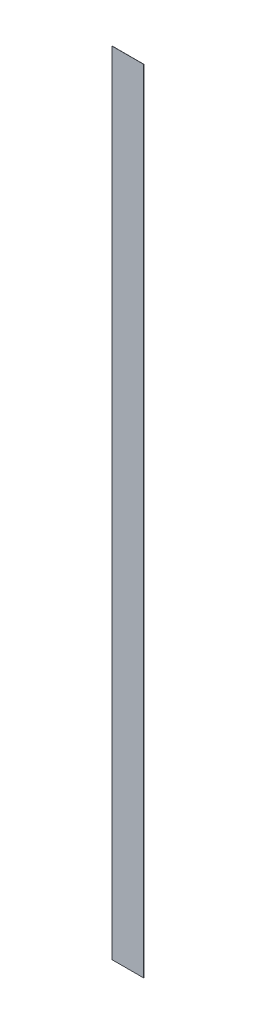
ISO-10303-21;
HEADER;
FILE_DESCRIPTION(('STEP AP214'),'2;1');
FILE_NAME('part.step','',(''),(''),'','','');
FILE_SCHEMA(('AUTOMOTIVE_DESIGN { 1 0 10303 214 1 1 1 1 }'));
ENDSEC;
DATA;
#1=APPLICATION_CONTEXT('core data for automotive mechanical design processes');
#2=APPLICATION_PROTOCOL_DEFINITION('international standard','automotive_design',2000,#1);
#3=PRODUCT_CONTEXT('',#1,'mechanical');
#4=PRODUCT('Part','Part','',(#3));
#5=PRODUCT_RELATED_PRODUCT_CATEGORY('part','',(#4));
#6=PRODUCT_DEFINITION_FORMATION('','',#4);
#7=PRODUCT_DEFINITION_CONTEXT('part definition',#1,'design');
#8=PRODUCT_DEFINITION('design','',#6,#7);
#9=PRODUCT_DEFINITION_SHAPE('','',#8);
#10=(LENGTH_UNIT() NAMED_UNIT(*) SI_UNIT(.MILLI.,.METRE.));
#11=(NAMED_UNIT(*) PLANE_ANGLE_UNIT() SI_UNIT($,.RADIAN.));
#12=(NAMED_UNIT(*) SI_UNIT($,.STERADIAN.) SOLID_ANGLE_UNIT());
#13=UNCERTAINTY_MEASURE_WITH_UNIT(LENGTH_MEASURE(1.E-05),#10,'distance_accuracy_value','');
#14=(GEOMETRIC_REPRESENTATION_CONTEXT(3) GLOBAL_UNCERTAINTY_ASSIGNED_CONTEXT((#13)) GLOBAL_UNIT_ASSIGNED_CONTEXT((#10,
#11,#12)) REPRESENTATION_CONTEXT('',''));
#15=CARTESIAN_POINT('',(0.,0.,0.));
#16=DIRECTION('',(0.,0.,1.));
#17=DIRECTION('',(1.,0.,0.));
#18=AXIS2_PLACEMENT_3D('',#15,#16,#17);
#19=CARTESIAN_POINT('',(0.,0.,15.));
#20=DIRECTION('',(-1.,0.,0.));
#21=DIRECTION('',(0.,0.,1.));
#22=AXIS2_PLACEMENT_3D('',#19,#20,#21);
#23=PLANE('',#22);
#24=DIRECTION('',(0.,1.,0.));
#25=VECTOR('',#24,1.);
#26=CARTESIAN_POINT('',(0.,0.,0.));
#27=LINE('',#26,#25);
#28=CARTESIAN_POINT('',(0.,0.,0.));
#29=VERTEX_POINT('',#28);
#30=CARTESIAN_POINT('',(0.,75000.,0.));
#31=VERTEX_POINT('',#30);
#32=EDGE_CURVE('E96',#29,#31,#27,.T.);
#33=ORIENTED_EDGE('',*,*,#32,.T.);
#34=DIRECTION('',(0.,0.,-1.));
#35=VECTOR('',#34,1.);
#36=CARTESIAN_POINT('',(0.,75000.,15.));
#37=LINE('',#36,#35);
#38=CARTESIAN_POINT('',(0.,75000.,15.));
#39=VERTEX_POINT('',#38);
#40=EDGE_CURVE('E11',#39,#31,#37,.T.);
#41=ORIENTED_EDGE('',*,*,#40,.F.);
#42=DIRECTION('',(0.,1.,0.));
#43=VECTOR('',#42,1.);
#44=CARTESIAN_POINT('',(0.,0.,15.));
#45=LINE('',#44,#43);
#46=CARTESIAN_POINT('',(0.,0.,15.));
#47=VERTEX_POINT('',#46);
#48=EDGE_CURVE('E84',#47,#39,#45,.T.);
#49=ORIENTED_EDGE('',*,*,#48,.F.);
#50=DIRECTION('',(0.,0.,-1.));
#51=VECTOR('',#50,1.);
#52=CARTESIAN_POINT('',(0.,0.,15.));
#53=LINE('',#52,#51);
#54=EDGE_CURVE('E92',#47,#29,#53,.T.);
#55=ORIENTED_EDGE('',*,*,#54,.T.);
#56=EDGE_LOOP('',(#33,#41,#49,#55));
#57=FACE_BOUND('',#56,.T.);
#58=ADVANCED_FACE('F33',(#57),#23,.F.);
#59=CARTESIAN_POINT('',(0.,75000.,15.));
#60=DIRECTION('',(0.,-1.,0.));
#61=DIRECTION('',(0.,0.,-1.));
#62=AXIS2_PLACEMENT_3D('',#59,#60,#61);
#63=PLANE('',#62);
#64=DIRECTION('',(-1.,0.,0.));
#65=VECTOR('',#64,1.);
#66=CARTESIAN_POINT('',(0.,75000.,0.));
#67=LINE('',#66,#65);
#68=CARTESIAN_POINT('',(-3000.,75000.,0.));
#69=VERTEX_POINT('',#68);
#70=EDGE_CURVE('E88',#31,#69,#67,.T.);
#71=ORIENTED_EDGE('',*,*,#70,.T.);
#72=DIRECTION('',(0.,0.,-1.));
#73=VECTOR('',#72,1.);
#74=CARTESIAN_POINT('',(-3000.,75000.,15.));
#75=LINE('',#74,#73);
#76=CARTESIAN_POINT('',(-3000.,75000.,15.));
#77=VERTEX_POINT('',#76);
#78=EDGE_CURVE('E41',#77,#69,#75,.T.);
#79=ORIENTED_EDGE('',*,*,#78,.F.);
#80=DIRECTION('',(-1.,0.,0.));
#81=VECTOR('',#80,1.);
#82=CARTESIAN_POINT('',(0.,75000.,15.));
#83=LINE('',#82,#81);
#84=EDGE_CURVE('E79',#39,#77,#83,.T.);
#85=ORIENTED_EDGE('',*,*,#84,.F.);
#86=ORIENTED_EDGE('',*,*,#40,.T.);
#87=EDGE_LOOP('',(#71,#79,#85,#86));
#88=FACE_BOUND('',#87,.T.);
#89=ADVANCED_FACE('F87',(#88),#63,.F.);
#90=CARTESIAN_POINT('',(-3000.,-3.67394039744206E-13,15.));
#91=DIRECTION('',(1.,0.,0.));
#92=DIRECTION('',(0.,0.,-1.));
#93=AXIS2_PLACEMENT_3D('',#90,#91,#92);
#94=PLANE('',#93);
#95=DIRECTION('',(0.,-1.,0.));
#96=VECTOR('',#95,1.);
#97=CARTESIAN_POINT('',(-3000.,-3.67394039744206E-13,0.));
#98=LINE('',#97,#96);
#99=CARTESIAN_POINT('',(-3000.,-3.67394039744206E-13,0.));
#100=VERTEX_POINT('',#99);
#101=EDGE_CURVE('E66',#69,#100,#98,.T.);
#102=ORIENTED_EDGE('',*,*,#101,.T.);
#103=DIRECTION('',(0.,0.,-1.));
#104=VECTOR('',#103,1.);
#105=CARTESIAN_POINT('',(-3000.,-3.67394039744206E-13,15.));
#106=LINE('',#105,#104);
#107=CARTESIAN_POINT('',(-3000.,-3.67394039744206E-13,15.));
#108=VERTEX_POINT('',#107);
#109=EDGE_CURVE('E89',#108,#100,#106,.T.);
#110=ORIENTED_EDGE('',*,*,#109,.F.);
#111=DIRECTION('',(0.,-1.,0.));
#112=VECTOR('',#111,1.);
#113=CARTESIAN_POINT('',(-3000.,-3.67394039744206E-13,15.));
#114=LINE('',#113,#112);
#115=EDGE_CURVE('E82',#77,#108,#114,.T.);
#116=ORIENTED_EDGE('',*,*,#115,.F.);
#117=ORIENTED_EDGE('',*,*,#78,.T.);
#118=EDGE_LOOP('',(#102,#110,#116,#117));
#119=FACE_BOUND('',#118,.T.);
#120=ADVANCED_FACE('F90',(#119),#94,.F.);
#121=CARTESIAN_POINT('',(0.,0.,15.));
#122=DIRECTION('',(0.,1.,0.));
#123=DIRECTION('',(-1.,0.,0.));
#124=AXIS2_PLACEMENT_3D('',#121,#122,#123);
#125=PLANE('',#124);
#126=DIRECTION('',(1.,0.,0.));
#127=VECTOR('',#126,1.);
#128=CARTESIAN_POINT('',(0.,0.,0.));
#129=LINE('',#128,#127);
#130=EDGE_CURVE('E72',#100,#29,#129,.T.);
#131=ORIENTED_EDGE('',*,*,#130,.T.);
#132=ORIENTED_EDGE('',*,*,#54,.F.);
#133=DIRECTION('',(1.,0.,0.));
#134=VECTOR('',#133,1.);
#135=CARTESIAN_POINT('',(0.,0.,15.));
#136=LINE('',#135,#134);
#137=EDGE_CURVE('E49',#108,#47,#136,.T.);
#138=ORIENTED_EDGE('',*,*,#137,.F.);
#139=ORIENTED_EDGE('',*,*,#109,.T.);
#140=EDGE_LOOP('',(#131,#132,#138,#139));
#141=FACE_BOUND('',#140,.T.);
#142=ADVANCED_FACE('F103',(#141),#125,.F.);
#143=CARTESIAN_POINT('',(0.,0.,15.));
#144=DIRECTION('',(0.,0.,1.));
#145=DIRECTION('',(1.,0.,0.));
#146=AXIS2_PLACEMENT_3D('',#143,#144,#145);
#147=PLANE('',#146);
#148=ORIENTED_EDGE('',*,*,#48,.T.);
#149=ORIENTED_EDGE('',*,*,#84,.T.);
#150=ORIENTED_EDGE('',*,*,#115,.T.);
#151=ORIENTED_EDGE('',*,*,#137,.T.);
#152=EDGE_LOOP('',(#148,#149,#150,#151));
#153=FACE_BOUND('',#152,.T.);
#154=ADVANCED_FACE('F80',(#153),#147,.T.);
#155=CARTESIAN_POINT('',(0.,0.,0.));
#156=DIRECTION('',(0.,0.,1.));
#157=DIRECTION('',(1.,0.,0.));
#158=AXIS2_PLACEMENT_3D('',#155,#156,#157);
#159=PLANE('',#158);
#160=ORIENTED_EDGE('',*,*,#32,.F.);
#161=ORIENTED_EDGE('',*,*,#130,.F.);
#162=ORIENTED_EDGE('',*,*,#101,.F.);
#163=ORIENTED_EDGE('',*,*,#70,.F.);
#164=EDGE_LOOP('',(#160,#161,#162,#163));
#165=FACE_BOUND('',#164,.T.);
#166=ADVANCED_FACE('F106',(#165),#159,.F.);
#167=CLOSED_SHELL('',(#58,#89,#120,#142,#154,#166));
#168=MANIFOLD_SOLID_BREP('B2',#167);
#169=ADVANCED_BREP_SHAPE_REPRESENTATION('',(#18,#168),#14);
#170=SHAPE_DEFINITION_REPRESENTATION(#9,#169);
ENDSEC;
END-ISO-10303-21;
